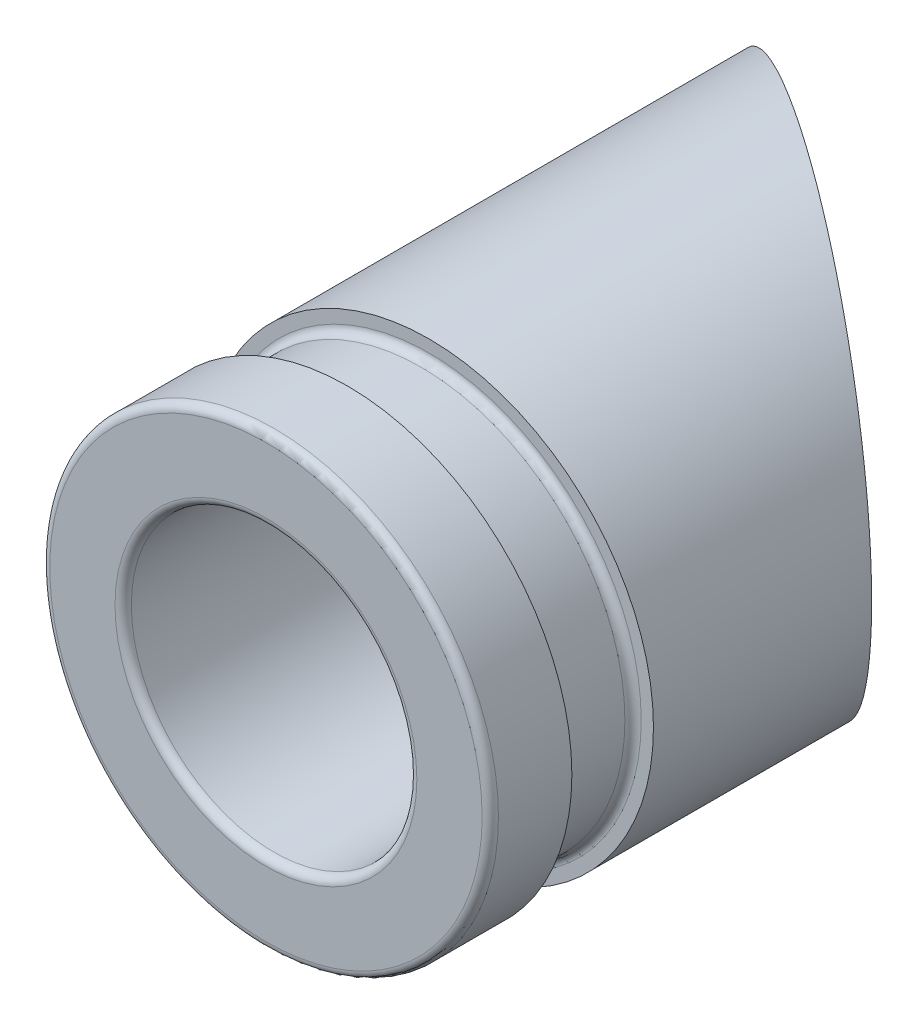
ISO-10303-21;
HEADER;
FILE_DESCRIPTION(('STEP AP214'),'2;1');
FILE_NAME('part.step','',(''),(''),'','','');
FILE_SCHEMA(('AUTOMOTIVE_DESIGN { 1 0 10303 214 1 1 1 1 }'));
ENDSEC;
DATA;
#1=APPLICATION_CONTEXT('core data for automotive mechanical design processes');
#2=APPLICATION_PROTOCOL_DEFINITION('international standard','automotive_design',2000,#1);
#3=PRODUCT_CONTEXT('',#1,'mechanical');
#4=PRODUCT('Part','Part','',(#3));
#5=PRODUCT_RELATED_PRODUCT_CATEGORY('part','',(#4));
#6=PRODUCT_DEFINITION_FORMATION('','',#4);
#7=PRODUCT_DEFINITION_CONTEXT('part definition',#1,'design');
#8=PRODUCT_DEFINITION('design','',#6,#7);
#9=PRODUCT_DEFINITION_SHAPE('','',#8);
#10=(LENGTH_UNIT() NAMED_UNIT(*) SI_UNIT(.MILLI.,.METRE.));
#11=(NAMED_UNIT(*) PLANE_ANGLE_UNIT() SI_UNIT($,.RADIAN.));
#12=(NAMED_UNIT(*) SI_UNIT($,.STERADIAN.) SOLID_ANGLE_UNIT());
#13=UNCERTAINTY_MEASURE_WITH_UNIT(LENGTH_MEASURE(1.E-05),#10,'distance_accuracy_value','');
#14=(GEOMETRIC_REPRESENTATION_CONTEXT(3) GLOBAL_UNCERTAINTY_ASSIGNED_CONTEXT((#13)) GLOBAL_UNIT_ASSIGNED_CONTEXT((#10,
#11,#12)) REPRESENTATION_CONTEXT('',''));
#15=CARTESIAN_POINT('',(0.,0.,0.));
#16=DIRECTION('',(0.,0.,1.));
#17=DIRECTION('',(1.,0.,0.));
#18=AXIS2_PLACEMENT_3D('',#15,#16,#17);
#19=CARTESIAN_POINT('',(6.35,6.985,31.75));
#20=DIRECTION('',(0.,0.,-1.));
#21=DIRECTION('',(-1.,0.,0.));
#22=AXIS2_PLACEMENT_3D('',#19,#20,#21);
#23=CYLINDRICAL_SURFACE('',#22,2.2225);
#24=CARTESIAN_POINT('',(6.35,6.985,20.193));
#25=DIRECTION('',(0.,0.,1.));
#26=DIRECTION('',(1.,0.,0.));
#27=AXIS2_PLACEMENT_3D('',#24,#25,#26);
#28=CIRCLE('',#27,2.2225);
#29=CARTESIAN_POINT('',(8.5725,6.985,20.193));
#30=VERTEX_POINT('',#29);
#31=EDGE_CURVE('E81',#30,#30,#28,.T.);
#32=ORIENTED_EDGE('',*,*,#31,.T.);
#33=EDGE_LOOP('',(#32));
#34=FACE_BOUND('',#33,.T.);
#35=CARTESIAN_POINT('',(6.35,6.985,12.0144898536439));
#36=DIRECTION('',(0.561342714566864,0.,-0.827583444011964));
#37=DIRECTION('',(-0.827583444011964,0.,-0.561342714566864));
#38=AXIS2_PLACEMENT_3D('',#35,#36,#37);
#39=ELLIPSE('',#38,2.68552979893574,2.2225);
#40=CARTESIAN_POINT('',(4.1275,6.985,10.5069872662591));
#41=VERTEX_POINT('',#40);
#42=EDGE_CURVE('E97',#41,#41,#39,.T.);
#43=ORIENTED_EDGE('',*,*,#42,.T.);
#44=EDGE_LOOP('',(#43));
#45=FACE_BOUND('',#44,.T.);
#46=ADVANCED_FACE('F61',(#34,#45),#23,.F.);
#47=CARTESIAN_POINT('',(6.35,6.985,20.32));
#48=DIRECTION('',(0.,0.,-1.));
#49=DIRECTION('',(-1.,0.,0.));
#50=AXIS2_PLACEMENT_3D('',#47,#48,#49);
#51=CYLINDRICAL_SURFACE('',#50,3.4925);
#52=CARTESIAN_POINT('',(6.35,6.985,17.78));
#53=DIRECTION('',(0.,0.,1.));
#54=DIRECTION('',(1.,0.,0.));
#55=AXIS2_PLACEMENT_3D('',#52,#53,#54);
#56=CIRCLE('',#55,3.4925);
#57=CARTESIAN_POINT('',(9.8425,6.985,17.78));
#58=VERTEX_POINT('',#57);
#59=EDGE_CURVE('E93',#58,#58,#56,.T.);
#60=ORIENTED_EDGE('',*,*,#59,.F.);
#61=EDGE_LOOP('',(#60));
#62=FACE_BOUND('',#61,.T.);
#63=CARTESIAN_POINT('',(6.35,6.985,12.0144898536439));
#64=DIRECTION('',(0.561342714566864,0.,-0.827583444011964));
#65=DIRECTION('',(-0.827583444011964,0.,-0.561342714566864));
#66=AXIS2_PLACEMENT_3D('',#63,#64,#65);
#67=ELLIPSE('',#66,4.22011825547045,3.4925);
#68=CARTESIAN_POINT('',(2.8575,6.985,9.64555721632493));
#69=VERTEX_POINT('',#68);
#70=EDGE_CURVE('E65',#69,#69,#67,.T.);
#71=ORIENTED_EDGE('',*,*,#70,.F.);
#72=EDGE_LOOP('',(#71));
#73=FACE_BOUND('',#72,.T.);
#74=ADVANCED_FACE('F108',(#62,#73),#51,.T.);
#75=CARTESIAN_POINT('',(6.35,6.985,20.193));
#76=DIRECTION('',(0.,0.,1.));
#77=DIRECTION('',(1.,0.,0.));
#78=AXIS2_PLACEMENT_3D('',#75,#76,#77);
#79=CIRCLE('',#78,3.4925);
#80=CARTESIAN_POINT('',(9.8425,6.985,20.193));
#81=VERTEX_POINT('',#80);
#82=EDGE_CURVE('E84',#81,#81,#79,.F.);
#83=ORIENTED_EDGE('',*,*,#82,.T.);
#84=EDGE_LOOP('',(#83));
#85=FACE_BOUND('',#84,.T.);
#86=CARTESIAN_POINT('',(6.35,6.985,19.05));
#87=DIRECTION('',(0.,0.,1.));
#88=DIRECTION('',(1.,0.,0.));
#89=AXIS2_PLACEMENT_3D('',#86,#87,#88);
#90=CIRCLE('',#89,3.4925);
#91=CARTESIAN_POINT('',(9.8425,6.985,19.05));
#92=VERTEX_POINT('',#91);
#93=EDGE_CURVE('E94',#92,#92,#90,.T.);
#94=ORIENTED_EDGE('',*,*,#93,.T.);
#95=EDGE_LOOP('',(#94));
#96=FACE_BOUND('',#95,.T.);
#97=ADVANCED_FACE('F110',(#85,#96),#51,.T.);
#98=CARTESIAN_POINT('',(6.35,6.985,20.32));
#99=DIRECTION('',(0.,0.,1.));
#100=DIRECTION('',(1.,0.,0.));
#101=AXIS2_PLACEMENT_3D('',#98,#99,#100);
#102=PLANE('',#101);
#103=CARTESIAN_POINT('',(6.35,6.985,20.32));
#104=DIRECTION('',(0.,0.,1.));
#105=DIRECTION('',(1.,0.,0.));
#106=AXIS2_PLACEMENT_3D('',#103,#104,#105);
#107=CIRCLE('',#106,3.3655);
#108=CARTESIAN_POINT('',(9.7155,6.985,20.32));
#109=VERTEX_POINT('',#108);
#110=EDGE_CURVE('E87',#109,#109,#107,.T.);
#111=ORIENTED_EDGE('',*,*,#110,.T.);
#112=EDGE_LOOP('',(#111));
#113=FACE_BOUND('',#112,.T.);
#114=CARTESIAN_POINT('',(6.35,6.985,20.32));
#115=DIRECTION('',(0.,0.,1.));
#116=DIRECTION('',(1.,0.,0.));
#117=AXIS2_PLACEMENT_3D('',#114,#115,#116);
#118=CIRCLE('',#117,2.3495);
#119=CARTESIAN_POINT('',(8.6995,6.985,20.32));
#120=VERTEX_POINT('',#119);
#121=EDGE_CURVE('E90',#120,#120,#118,.F.);
#122=ORIENTED_EDGE('',*,*,#121,.T.);
#123=EDGE_LOOP('',(#122));
#124=FACE_BOUND('',#123,.T.);
#125=ADVANCED_FACE('F118',(#113,#124),#102,.T.);
#126=CARTESIAN_POINT('',(6.35,6.985,17.78));
#127=DIRECTION('',(0.,0.,1.));
#128=DIRECTION('',(1.,0.,0.));
#129=AXIS2_PLACEMENT_3D('',#126,#127,#128);
#130=PLANE('',#129);
#131=CARTESIAN_POINT('',(6.35,6.985,17.78));
#132=DIRECTION('',(0.,0.,1.));
#133=DIRECTION('',(1.,0.,0.));
#134=AXIS2_PLACEMENT_3D('',#131,#132,#133);
#135=CIRCLE('',#134,3.302);
#136=CARTESIAN_POINT('',(9.652,6.985,17.78));
#137=VERTEX_POINT('',#136);
#138=EDGE_CURVE('E11',#137,#137,#135,.F.);
#139=ORIENTED_EDGE('',*,*,#138,.T.);
#140=EDGE_LOOP('',(#139));
#141=FACE_BOUND('',#140,.T.);
#142=ORIENTED_EDGE('',*,*,#59,.T.);
#143=EDGE_LOOP('',(#142));
#144=FACE_BOUND('',#143,.T.);
#145=ADVANCED_FACE('F148',(#141,#144),#130,.T.);
#146=CARTESIAN_POINT('',(6.35,6.985,19.05));
#147=DIRECTION('',(0.,0.,1.));
#148=DIRECTION('',(1.,0.,0.));
#149=AXIS2_PLACEMENT_3D('',#146,#147,#148);
#150=PLANE('',#149);
#151=CARTESIAN_POINT('',(6.35,6.985,19.05));
#152=DIRECTION('',(0.,0.,1.));
#153=DIRECTION('',(1.,0.,0.));
#154=AXIS2_PLACEMENT_3D('',#151,#152,#153);
#155=CIRCLE('',#154,3.302);
#156=CARTESIAN_POINT('',(9.652,6.985,19.05));
#157=VERTEX_POINT('',#156);
#158=EDGE_CURVE('E78',#157,#157,#155,.T.);
#159=ORIENTED_EDGE('',*,*,#158,.T.);
#160=EDGE_LOOP('',(#159));
#161=FACE_BOUND('',#160,.T.);
#162=ORIENTED_EDGE('',*,*,#93,.F.);
#163=EDGE_LOOP('',(#162));
#164=FACE_BOUND('',#163,.T.);
#165=ADVANCED_FACE('F145',(#161,#164),#150,.F.);
#166=CARTESIAN_POINT('',(6.35,6.985,17.78));
#167=DIRECTION('',(0.,0.,1.));
#168=DIRECTION('',(1.,0.,0.));
#169=AXIS2_PLACEMENT_3D('',#166,#167,#168);
#170=CYLINDRICAL_SURFACE('',#169,3.175);
#171=CARTESIAN_POINT('',(6.35,6.985,18.923));
#172=DIRECTION('',(0.,0.,1.));
#173=DIRECTION('',(1.,0.,0.));
#174=AXIS2_PLACEMENT_3D('',#171,#172,#173);
#175=CIRCLE('',#174,3.175);
#176=CARTESIAN_POINT('',(9.525,6.985,18.923));
#177=VERTEX_POINT('',#176);
#178=EDGE_CURVE('E69',#177,#177,#175,.F.);
#179=ORIENTED_EDGE('',*,*,#178,.T.);
#180=EDGE_LOOP('',(#179));
#181=FACE_BOUND('',#180,.T.);
#182=CARTESIAN_POINT('',(6.35,6.985,17.907));
#183=DIRECTION('',(0.,0.,1.));
#184=DIRECTION('',(1.,0.,0.));
#185=AXIS2_PLACEMENT_3D('',#182,#183,#184);
#186=CIRCLE('',#185,3.175);
#187=CARTESIAN_POINT('',(9.525,6.985,17.907));
#188=VERTEX_POINT('',#187);
#189=EDGE_CURVE('E73',#188,#188,#186,.T.);
#190=ORIENTED_EDGE('',*,*,#189,.T.);
#191=EDGE_LOOP('',(#190));
#192=FACE_BOUND('',#191,.T.);
#193=ADVANCED_FACE('F130',(#181,#192),#170,.T.);
#194=CARTESIAN_POINT('',(6.35,6.985,20.193));
#195=DIRECTION('',(0.,0.,1.));
#196=DIRECTION('',(1.,0.,0.));
#197=AXIS2_PLACEMENT_3D('',#194,#195,#196);
#198=TOROIDAL_SURFACE('',#197,3.3655,0.127);
#199=ORIENTED_EDGE('',*,*,#82,.F.);
#200=EDGE_LOOP('',(#199));
#201=FACE_BOUND('',#200,.T.);
#202=ORIENTED_EDGE('',*,*,#110,.F.);
#203=EDGE_LOOP('',(#202));
#204=FACE_BOUND('',#203,.T.);
#205=ADVANCED_FACE('F126',(#201,#204),#198,.T.);
#206=CARTESIAN_POINT('',(6.35,6.985,20.193));
#207=DIRECTION('',(0.,0.,1.));
#208=DIRECTION('',(1.,0.,0.));
#209=AXIS2_PLACEMENT_3D('',#206,#207,#208);
#210=TOROIDAL_SURFACE('',#209,2.3495,0.127);
#211=ORIENTED_EDGE('',*,*,#121,.F.);
#212=EDGE_LOOP('',(#211));
#213=FACE_BOUND('',#212,.T.);
#214=ORIENTED_EDGE('',*,*,#31,.F.);
#215=EDGE_LOOP('',(#214));
#216=FACE_BOUND('',#215,.T.);
#217=ADVANCED_FACE('F129',(#213,#216),#210,.T.);
#218=CARTESIAN_POINT('',(6.35,6.985,18.923));
#219=DIRECTION('',(0.,0.,1.));
#220=DIRECTION('',(1.,0.,0.));
#221=AXIS2_PLACEMENT_3D('',#218,#219,#220);
#222=TOROIDAL_SURFACE('',#221,3.302,0.127);
#223=ORIENTED_EDGE('',*,*,#178,.F.);
#224=EDGE_LOOP('',(#223));
#225=FACE_BOUND('',#224,.T.);
#226=ORIENTED_EDGE('',*,*,#158,.F.);
#227=EDGE_LOOP('',(#226));
#228=FACE_BOUND('',#227,.T.);
#229=ADVANCED_FACE('F133',(#225,#228),#222,.F.);
#230=CARTESIAN_POINT('',(6.35,6.985,17.907));
#231=DIRECTION('',(0.,0.,1.));
#232=DIRECTION('',(1.,0.,0.));
#233=AXIS2_PLACEMENT_3D('',#230,#231,#232);
#234=TOROIDAL_SURFACE('',#233,3.302,0.127);
#235=ORIENTED_EDGE('',*,*,#138,.F.);
#236=EDGE_LOOP('',(#235));
#237=FACE_BOUND('',#236,.T.);
#238=ORIENTED_EDGE('',*,*,#189,.F.);
#239=EDGE_LOOP('',(#238));
#240=FACE_BOUND('',#239,.T.);
#241=ADVANCED_FACE('F63',(#237,#240),#234,.F.);
#242=CARTESIAN_POINT('',(0.,78.74,7.70733960397306));
#243=DIRECTION('',(0.561342714566864,0.,-0.827583444011964));
#244=DIRECTION('',(-0.827583444011964,0.,-0.561342714566864));
#245=AXIS2_PLACEMENT_3D('',#242,#243,#244);
#246=PLANE('',#245);
#247=ORIENTED_EDGE('',*,*,#42,.F.);
#248=EDGE_LOOP('',(#247));
#249=FACE_BOUND('',#248,.T.);
#250=ORIENTED_EDGE('',*,*,#70,.T.);
#251=EDGE_LOOP('',(#250));
#252=FACE_BOUND('',#251,.T.);
#253=ADVANCED_FACE('F106',(#249,#252),#246,.T.);
#254=CLOSED_SHELL('',(#46,#74,#97,#125,#145,#165,#193,#205,#217,#229,#241,#253));
#255=MANIFOLD_SOLID_BREP('B2',#254);
#256=ADVANCED_BREP_SHAPE_REPRESENTATION('',(#18,#255),#14);
#257=SHAPE_DEFINITION_REPRESENTATION(#9,#256);
ENDSEC;
END-ISO-10303-21;
